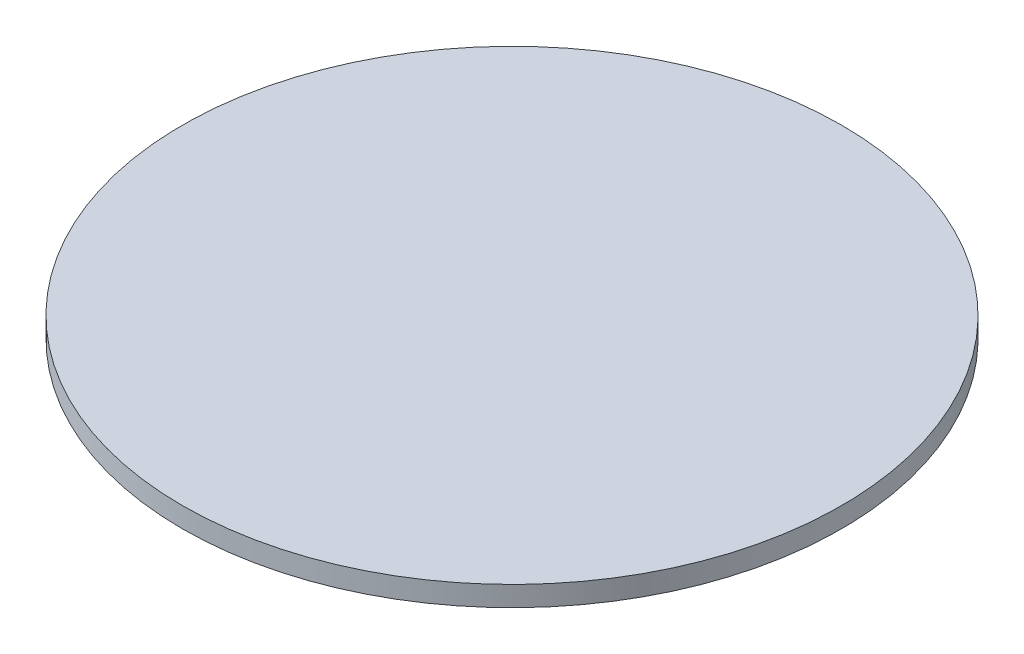
ISO-10303-21;
HEADER;
FILE_DESCRIPTION(('STEP AP214'),'2;1');
FILE_NAME('part.step','',(''),(''),'','','');
FILE_SCHEMA(('AUTOMOTIVE_DESIGN { 1 0 10303 214 1 1 1 1 }'));
ENDSEC;
DATA;
#1=APPLICATION_CONTEXT('core data for automotive mechanical design processes');
#2=APPLICATION_PROTOCOL_DEFINITION('international standard','automotive_design',2000,#1);
#3=PRODUCT_CONTEXT('',#1,'mechanical');
#4=PRODUCT('Part','Part','',(#3));
#5=PRODUCT_RELATED_PRODUCT_CATEGORY('part','',(#4));
#6=PRODUCT_DEFINITION_FORMATION('','',#4);
#7=PRODUCT_DEFINITION_CONTEXT('part definition',#1,'design');
#8=PRODUCT_DEFINITION('design','',#6,#7);
#9=PRODUCT_DEFINITION_SHAPE('','',#8);
#10=(LENGTH_UNIT() NAMED_UNIT(*) SI_UNIT(.MILLI.,.METRE.));
#11=(NAMED_UNIT(*) PLANE_ANGLE_UNIT() SI_UNIT($,.RADIAN.));
#12=(NAMED_UNIT(*) SI_UNIT($,.STERADIAN.) SOLID_ANGLE_UNIT());
#13=UNCERTAINTY_MEASURE_WITH_UNIT(LENGTH_MEASURE(1.E-05),#10,'distance_accuracy_value','');
#14=(GEOMETRIC_REPRESENTATION_CONTEXT(3) GLOBAL_UNCERTAINTY_ASSIGNED_CONTEXT((#13)) GLOBAL_UNIT_ASSIGNED_CONTEXT((#10,
#11,#12)) REPRESENTATION_CONTEXT('',''));
#15=CARTESIAN_POINT('',(0.,0.,0.));
#16=DIRECTION('',(0.,0.,1.));
#17=DIRECTION('',(1.,0.,0.));
#18=AXIS2_PLACEMENT_3D('',#15,#16,#17);
#19=CARTESIAN_POINT('',(0.,1.1,0.));
#20=DIRECTION('',(0.,-1.,0.));
#21=DIRECTION('',(0.,0.,-1.));
#22=AXIS2_PLACEMENT_3D('',#19,#20,#21);
#23=CYLINDRICAL_SURFACE('',#22,18.);
#24=CARTESIAN_POINT('',(0.,1.1,0.));
#25=DIRECTION('',(0.,1.,0.));
#26=DIRECTION('',(0.,0.,1.));
#27=AXIS2_PLACEMENT_3D('',#24,#25,#26);
#28=CIRCLE('',#27,18.);
#29=CARTESIAN_POINT('',(0.,1.1,18.));
#30=VERTEX_POINT('',#29);
#31=EDGE_CURVE('E10',#30,#30,#28,.T.);
#32=ORIENTED_EDGE('',*,*,#31,.F.);
#33=EDGE_LOOP('',(#32));
#34=FACE_BOUND('',#33,.T.);
#35=CARTESIAN_POINT('',(0.,0.,0.));
#36=DIRECTION('',(0.,1.,0.));
#37=DIRECTION('',(0.,0.,1.));
#38=AXIS2_PLACEMENT_3D('',#35,#36,#37);
#39=CIRCLE('',#38,18.);
#40=CARTESIAN_POINT('',(0.,0.,18.));
#41=VERTEX_POINT('',#40);
#42=EDGE_CURVE('E34',#41,#41,#39,.T.);
#43=ORIENTED_EDGE('',*,*,#42,.T.);
#44=EDGE_LOOP('',(#43));
#45=FACE_BOUND('',#44,.T.);
#46=ADVANCED_FACE('F31',(#34,#45),#23,.T.);
#47=CARTESIAN_POINT('',(0.,1.1,0.));
#48=DIRECTION('',(0.,1.,0.));
#49=DIRECTION('',(0.,0.,1.));
#50=AXIS2_PLACEMENT_3D('',#47,#48,#49);
#51=PLANE('',#50);
#52=ORIENTED_EDGE('',*,*,#31,.T.);
#53=EDGE_LOOP('',(#52));
#54=FACE_BOUND('',#53,.T.);
#55=ADVANCED_FACE('F46',(#54),#51,.T.);
#56=CARTESIAN_POINT('',(0.,0.,0.));
#57=DIRECTION('',(0.,1.,0.));
#58=DIRECTION('',(0.,0.,1.));
#59=AXIS2_PLACEMENT_3D('',#56,#57,#58);
#60=PLANE('',#59);
#61=ORIENTED_EDGE('',*,*,#42,.F.);
#62=EDGE_LOOP('',(#61));
#63=FACE_BOUND('',#62,.T.);
#64=ADVANCED_FACE('F44',(#63),#60,.F.);
#65=CLOSED_SHELL('',(#46,#55,#64));
#66=MANIFOLD_SOLID_BREP('B2',#65);
#67=ADVANCED_BREP_SHAPE_REPRESENTATION('',(#18,#66),#14);
#68=SHAPE_DEFINITION_REPRESENTATION(#9,#67);
ENDSEC;
END-ISO-10303-21;
